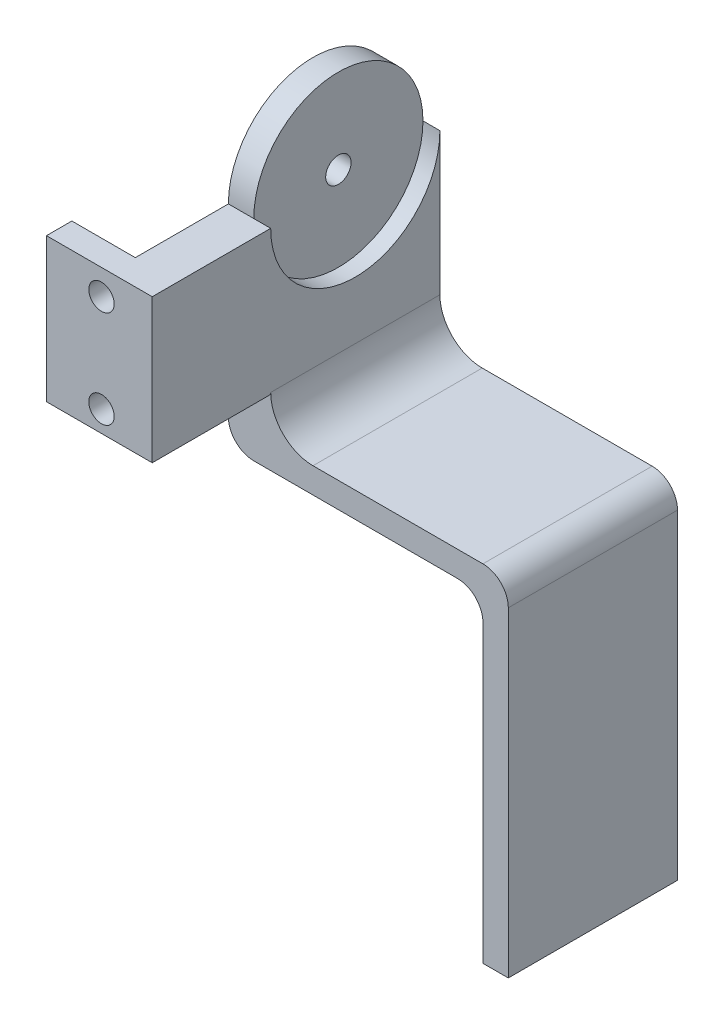
ISO-10303-21;
HEADER;
FILE_DESCRIPTION(('STEP AP214'),'2;1');
FILE_NAME('part.step','',(''),(''),'','','');
FILE_SCHEMA(('AUTOMOTIVE_DESIGN { 1 0 10303 214 1 1 1 1 }'));
ENDSEC;
DATA;
#1=APPLICATION_CONTEXT('core data for automotive mechanical design processes');
#2=APPLICATION_PROTOCOL_DEFINITION('international standard','automotive_design',2000,#1);
#3=PRODUCT_CONTEXT('',#1,'mechanical');
#4=PRODUCT('Part','Part','',(#3));
#5=PRODUCT_RELATED_PRODUCT_CATEGORY('part','',(#4));
#6=PRODUCT_DEFINITION_FORMATION('','',#4);
#7=PRODUCT_DEFINITION_CONTEXT('part definition',#1,'design');
#8=PRODUCT_DEFINITION('design','',#6,#7);
#9=PRODUCT_DEFINITION_SHAPE('','',#8);
#10=(LENGTH_UNIT() NAMED_UNIT(*) SI_UNIT(.MILLI.,.METRE.));
#11=(NAMED_UNIT(*) PLANE_ANGLE_UNIT() SI_UNIT($,.RADIAN.));
#12=(NAMED_UNIT(*) SI_UNIT($,.STERADIAN.) SOLID_ANGLE_UNIT());
#13=UNCERTAINTY_MEASURE_WITH_UNIT(LENGTH_MEASURE(1.E-05),#10,'distance_accuracy_value','');
#14=(GEOMETRIC_REPRESENTATION_CONTEXT(3) GLOBAL_UNCERTAINTY_ASSIGNED_CONTEXT((#13)) GLOBAL_UNIT_ASSIGNED_CONTEXT((#10,
#11,#12)) REPRESENTATION_CONTEXT('',''));
#15=CARTESIAN_POINT('',(0.,0.,0.));
#16=DIRECTION('',(0.,0.,1.));
#17=DIRECTION('',(1.,0.,0.));
#18=AXIS2_PLACEMENT_3D('',#15,#16,#17);
#19=CARTESIAN_POINT('',(-30.0845383421613,31.8,20.));
#20=DIRECTION('',(-1.,0.,0.));
#21=DIRECTION('',(0.,-1.,0.));
#22=AXIS2_PLACEMENT_3D('',#19,#20,#21);
#23=PLANE('',#22);
#24=CARTESIAN_POINT('',(-30.0845383421613,21.8000000000001,10.));
#25=DIRECTION('',(-1.,0.,0.));
#26=DIRECTION('',(0.,-1.,0.));
#27=AXIS2_PLACEMENT_3D('',#24,#25,#26);
#28=CIRCLE('',#27,1.5);
#29=CARTESIAN_POINT('',(-30.0845383421613,20.3000000000001,10.));
#30=VERTEX_POINT('',#29);
#31=EDGE_CURVE('E307',#30,#30,#28,.T.);
#32=ORIENTED_EDGE('',*,*,#31,.T.);
#33=EDGE_LOOP('',(#32));
#34=FACE_BOUND('',#33,.T.);
#35=CARTESIAN_POINT('',(-30.0845383421613,21.8,10.));
#36=DIRECTION('',(-1.,0.,0.));
#37=DIRECTION('',(0.,1.,0.));
#38=AXIS2_PLACEMENT_3D('',#35,#36,#37);
#39=CIRCLE('',#38,10.);
#40=CARTESIAN_POINT('',(-30.0845383421613,21.8,0.));
#41=VERTEX_POINT('',#40);
#42=CARTESIAN_POINT('',(-30.0845383421613,21.8,20.));
#43=VERTEX_POINT('',#42);
#44=EDGE_CURVE('E244',#41,#43,#39,.T.);
#45=ORIENTED_EDGE('',*,*,#44,.F.);
#46=CARTESIAN_POINT('',(-30.0845383421613,21.8,10.));
#47=DIRECTION('',(1.,0.,0.));
#48=DIRECTION('',(0.,1.,0.));
#49=AXIS2_PLACEMENT_3D('',#46,#47,#48);
#50=CIRCLE('',#49,10.);
#51=EDGE_CURVE('E348',#41,#43,#50,.T.);
#52=ORIENTED_EDGE('',*,*,#51,.T.);
#53=EDGE_LOOP('',(#45,#52));
#54=FACE_BOUND('',#53,.T.);
#55=ADVANCED_FACE('F52',(#34,#54),#23,.F.);
#56=CARTESIAN_POINT('',(-40.5845383421613,21.8,31.));
#57=DIRECTION('',(0.,0.,1.));
#58=DIRECTION('',(0.,-1.,0.));
#59=AXIS2_PLACEMENT_3D('',#56,#57,#58);
#60=PLANE('',#59);
#61=CARTESIAN_POINT('',(-34.0845383421613,18.8000000000001,31.));
#62=DIRECTION('',(0.,0.,1.));
#63=DIRECTION('',(0.,-1.,0.));
#64=AXIS2_PLACEMENT_3D('',#61,#62,#63);
#65=CIRCLE('',#64,1.5);
#66=CARTESIAN_POINT('',(-34.0845383421613,17.3000000000001,31.));
#67=VERTEX_POINT('',#66);
#68=EDGE_CURVE('E419',#67,#67,#65,.T.);
#69=ORIENTED_EDGE('',*,*,#68,.T.);
#70=EDGE_LOOP('',(#69));
#71=FACE_BOUND('',#70,.T.);
#72=DIRECTION('',(1.,0.,0.));
#73=VECTOR('',#72,1.);
#74=CARTESIAN_POINT('',(-33.0845383421613,15.3000000000001,31.));
#75=LINE('',#74,#73);
#76=CARTESIAN_POINT('',(-40.5845383421613,15.3000000000001,31.));
#77=VERTEX_POINT('',#76);
#78=CARTESIAN_POINT('',(-33.0845383421613,15.3000000000001,31.));
#79=VERTEX_POINT('',#78);
#80=EDGE_CURVE('E263',#77,#79,#75,.T.);
#81=ORIENTED_EDGE('',*,*,#80,.F.);
#82=DIRECTION('',(0.,-1.,0.));
#83=VECTOR('',#82,1.);
#84=CARTESIAN_POINT('',(-40.5845383421613,21.8,31.));
#85=LINE('',#84,#83);
#86=CARTESIAN_POINT('',(-40.5845383421613,21.8,31.));
#87=VERTEX_POINT('',#86);
#88=EDGE_CURVE('E325',#87,#77,#85,.T.);
#89=ORIENTED_EDGE('',*,*,#88,.F.);
#90=DIRECTION('',(1.,0.,0.));
#91=VECTOR('',#90,1.);
#92=CARTESIAN_POINT('',(-40.5845383421613,21.8,31.));
#93=LINE('',#92,#91);
#94=CARTESIAN_POINT('',(-33.0845383421613,21.8,31.));
#95=VERTEX_POINT('',#94);
#96=EDGE_CURVE('E333',#87,#95,#93,.T.);
#97=ORIENTED_EDGE('',*,*,#96,.T.);
#98=DIRECTION('',(0.,-1.,0.));
#99=VECTOR('',#98,1.);
#100=CARTESIAN_POINT('',(-33.0845383421613,21.8,31.));
#101=LINE('',#100,#99);
#102=CARTESIAN_POINT('',(-33.0845383421613,21.6284271247463,31.));
#103=VERTEX_POINT('',#102);
#104=EDGE_CURVE('E319',#95,#103,#101,.T.);
#105=ORIENTED_EDGE('',*,*,#104,.T.);
#106=CARTESIAN_POINT('',(-34.0845383421613,18.8000000000001,31.));
#107=DIRECTION('',(0.,0.,-1.));
#108=DIRECTION('',(0.,1.,0.));
#109=AXIS2_PLACEMENT_3D('',#106,#107,#108);
#110=CIRCLE('',#109,3.);
#111=CARTESIAN_POINT('',(-33.0845383421613,15.9715728752539,31.));
#112=VERTEX_POINT('',#111);
#113=EDGE_CURVE('E279',#103,#112,#110,.T.);
#114=ORIENTED_EDGE('',*,*,#113,.T.);
#115=EDGE_CURVE('E331',#112,#79,#101,.T.);
#116=ORIENTED_EDGE('',*,*,#115,.T.);
#117=EDGE_LOOP('',(#81,#89,#97,#105,#114,#116));
#118=FACE_BOUND('',#117,.T.);
#119=ADVANCED_FACE('F442',(#71,#118),#60,.F.);
#120=CARTESIAN_POINT('',(-33.0845383421613,31.8,20.));
#121=DIRECTION('',(1.,0.,0.));
#122=DIRECTION('',(0.,1.,0.));
#123=AXIS2_PLACEMENT_3D('',#120,#121,#122);
#124=PLANE('',#123);
#125=CARTESIAN_POINT('',(-33.0845383421613,21.8000000000001,10.));
#126=DIRECTION('',(-1.,0.,0.));
#127=DIRECTION('',(0.,-1.,0.));
#128=AXIS2_PLACEMENT_3D('',#125,#126,#127);
#129=CIRCLE('',#128,1.5);
#130=CARTESIAN_POINT('',(-33.0845383421613,20.3000000000001,10.));
#131=VERTEX_POINT('',#130);
#132=EDGE_CURVE('E304',#131,#131,#129,.T.);
#133=ORIENTED_EDGE('',*,*,#132,.F.);
#134=EDGE_LOOP('',(#133));
#135=FACE_BOUND('',#134,.T.);
#136=CARTESIAN_POINT('',(-33.0845383421613,11.3000000000001,31.));
#137=VERTEX_POINT('',#136);
#138=CARTESIAN_POINT('',(-33.0845383421613,10.1284271247463,31.));
#139=VERTEX_POINT('',#138);
#140=EDGE_CURVE('E314',#137,#139,#101,.T.);
#141=ORIENTED_EDGE('',*,*,#140,.F.);
#142=DIRECTION('',(0.,0.,-1.));
#143=VECTOR('',#142,1.);
#144=CARTESIAN_POINT('',(-33.0845383421613,11.3000000000001,25.5));
#145=LINE('',#144,#143);
#146=CARTESIAN_POINT('',(-33.0845383421613,11.3000000000001,25.5));
#147=VERTEX_POINT('',#146);
#148=EDGE_CURVE('E272',#137,#147,#145,.T.);
#149=ORIENTED_EDGE('',*,*,#148,.T.);
#150=DIRECTION('',(0.,1.,0.));
#151=VECTOR('',#150,1.);
#152=CARTESIAN_POINT('',(-33.0845383421613,11.3000000000001,25.5));
#153=LINE('',#152,#151);
#154=CARTESIAN_POINT('',(-33.0845383421613,15.3000000000001,25.5));
#155=VERTEX_POINT('',#154);
#156=EDGE_CURVE('E276',#147,#155,#153,.T.);
#157=ORIENTED_EDGE('',*,*,#156,.T.);
#158=DIRECTION('',(0.,0.,-1.));
#159=VECTOR('',#158,1.);
#160=CARTESIAN_POINT('',(-33.0845383421613,15.3000000000001,25.5));
#161=LINE('',#160,#159);
#162=EDGE_CURVE('E265',#79,#155,#161,.T.);
#163=ORIENTED_EDGE('',*,*,#162,.F.);
#164=ORIENTED_EDGE('',*,*,#115,.F.);
#165=DIRECTION('',(0.,0.,1.));
#166=VECTOR('',#165,1.);
#167=CARTESIAN_POINT('',(-33.0845383421613,15.9715728752539,23.));
#168=LINE('',#167,#166);
#169=CARTESIAN_POINT('',(-33.0845383421613,15.9715728752539,23.));
#170=VERTEX_POINT('',#169);
#171=EDGE_CURVE('E284',#170,#112,#168,.T.);
#172=ORIENTED_EDGE('',*,*,#171,.F.);
#173=DIRECTION('',(0.,1.,0.));
#174=VECTOR('',#173,1.);
#175=CARTESIAN_POINT('',(-33.0845383421613,31.8,23.));
#176=LINE('',#175,#174);
#177=CARTESIAN_POINT('',(-33.0845383421613,21.6284271247463,23.));
#178=VERTEX_POINT('',#177);
#179=EDGE_CURVE('E60',#170,#178,#176,.T.);
#180=ORIENTED_EDGE('',*,*,#179,.T.);
#181=DIRECTION('',(0.,0.,1.));
#182=VECTOR('',#181,1.);
#183=CARTESIAN_POINT('',(-33.0845383421613,21.6284271247463,23.));
#184=LINE('',#183,#182);
#185=EDGE_CURVE('E294',#103,#178,#184,.F.);
#186=ORIENTED_EDGE('',*,*,#185,.F.);
#187=ORIENTED_EDGE('',*,*,#104,.F.);
#188=DIRECTION('',(0.,0.,-1.));
#189=VECTOR('',#188,1.);
#190=CARTESIAN_POINT('',(-33.0845383421613,21.8,34.));
#191=LINE('',#190,#189);
#192=CARTESIAN_POINT('',(-33.0845383421613,21.8,20.));
#193=VERTEX_POINT('',#192);
#194=EDGE_CURVE('E340',#95,#193,#191,.T.);
#195=ORIENTED_EDGE('',*,*,#194,.T.);
#196=CARTESIAN_POINT('',(-33.0845383421613,21.8,10.));
#197=DIRECTION('',(1.,0.,0.));
#198=DIRECTION('',(0.,1.,0.));
#199=AXIS2_PLACEMENT_3D('',#196,#197,#198);
#200=CIRCLE('',#199,10.);
#201=CARTESIAN_POINT('',(-33.0845383421613,21.8,0.));
#202=VERTEX_POINT('',#201);
#203=EDGE_CURVE('E349',#202,#193,#200,.T.);
#204=ORIENTED_EDGE('',*,*,#203,.F.);
#205=DIRECTION('',(0.,-1.,0.));
#206=VECTOR('',#205,1.);
#207=CARTESIAN_POINT('',(-33.0845383421613,31.8,0.));
#208=LINE('',#207,#206);
#209=CARTESIAN_POINT('',(-33.0845383421613,0.,0.));
#210=VERTEX_POINT('',#209);
#211=EDGE_CURVE('E385',#202,#210,#208,.T.);
#212=ORIENTED_EDGE('',*,*,#211,.T.);
#213=DIRECTION('',(0.,0.,-1.));
#214=VECTOR('',#213,1.);
#215=CARTESIAN_POINT('',(-33.0845383421613,0.,20.));
#216=LINE('',#215,#214);
#217=CARTESIAN_POINT('',(-33.0845383421613,0.,20.));
#218=VERTEX_POINT('',#217);
#219=EDGE_CURVE('E405',#218,#210,#216,.T.);
#220=ORIENTED_EDGE('',*,*,#219,.F.);
#221=DIRECTION('',(0.,-1.,0.));
#222=VECTOR('',#221,1.);
#223=CARTESIAN_POINT('',(-33.0845383421613,31.8,20.));
#224=LINE('',#223,#222);
#225=CARTESIAN_POINT('',(-33.0845383421613,4.80000000000012,20.));
#226=VERTEX_POINT('',#225);
#227=EDGE_CURVE('E367',#226,#218,#224,.T.);
#228=ORIENTED_EDGE('',*,*,#227,.F.);
#229=DIRECTION('',(0.,0.,-1.));
#230=VECTOR('',#229,1.);
#231=CARTESIAN_POINT('',(-33.0845383421613,4.80000000000012,34.));
#232=LINE('',#231,#230);
#233=CARTESIAN_POINT('',(-33.0845383421613,4.80000000000012,23.));
#234=VERTEX_POINT('',#233);
#235=EDGE_CURVE('E343',#234,#226,#232,.T.);
#236=ORIENTED_EDGE('',*,*,#235,.F.);
#237=DIRECTION('',(0.,1.,0.));
#238=VECTOR('',#237,1.);
#239=CARTESIAN_POINT('',(-33.0845383421613,31.8,23.));
#240=LINE('',#239,#238);
#241=CARTESIAN_POINT('',(-33.0845383421613,10.1284271247463,23.));
#242=VERTEX_POINT('',#241);
#243=EDGE_CURVE('E301',#234,#242,#240,.T.);
#244=ORIENTED_EDGE('',*,*,#243,.T.);
#245=DIRECTION('',(0.,0.,1.));
#246=VECTOR('',#245,1.);
#247=CARTESIAN_POINT('',(-33.0845383421613,10.1284271247463,23.));
#248=LINE('',#247,#246);
#249=EDGE_CURVE('E299',#139,#242,#248,.F.);
#250=ORIENTED_EDGE('',*,*,#249,.F.);
#251=EDGE_LOOP('',(#141,#149,#157,#163,#164,#172,#180,#186,#187,#195,#204,#212,#220,#228,#236,
#244,#250));
#252=FACE_BOUND('',#251,.T.);
#253=ADVANCED_FACE('F431',(#135,#252),#124,.F.);
#254=CARTESIAN_POINT('',(-3.,-3.,20.));
#255=DIRECTION('',(0.,0.,1.));
#256=DIRECTION('',(1.,0.,0.));
#257=AXIS2_PLACEMENT_3D('',#254,#255,#256);
#258=PLANE('',#257);
#259=DIRECTION('',(-1.,0.,0.));
#260=VECTOR('',#259,1.);
#261=CARTESIAN_POINT('',(-3.00000000000002,0.,20.));
#262=LINE('',#261,#260);
#263=CARTESIAN_POINT('',(-3.00000000000002,0.,20.));
#264=VERTEX_POINT('',#263);
#265=CARTESIAN_POINT('',(-23.0845383421613,0.,20.));
#266=VERTEX_POINT('',#265);
#267=EDGE_CURVE('E365',#264,#266,#262,.T.);
#268=ORIENTED_EDGE('',*,*,#267,.T.);
#269=CARTESIAN_POINT('',(-23.0845383421613,5.,20.));
#270=DIRECTION('',(0.,0.,1.));
#271=DIRECTION('',(-1.,0.,0.));
#272=AXIS2_PLACEMENT_3D('',#269,#270,#271);
#273=CIRCLE('',#272,5.);
#274=CARTESIAN_POINT('',(-28.0845383421613,5.,20.));
#275=VERTEX_POINT('',#274);
#276=EDGE_CURVE('E238',#275,#266,#273,.T.);
#277=ORIENTED_EDGE('',*,*,#276,.F.);
#278=DIRECTION('',(0.,1.,0.));
#279=VECTOR('',#278,1.);
#280=CARTESIAN_POINT('',(-28.0845383421613,0.,20.));
#281=LINE('',#280,#279);
#282=CARTESIAN_POINT('',(-28.0845383421613,4.80000000000012,20.));
#283=VERTEX_POINT('',#282);
#284=EDGE_CURVE('E12',#283,#275,#281,.T.);
#285=ORIENTED_EDGE('',*,*,#284,.F.);
#286=DIRECTION('',(1.,0.,0.));
#287=VECTOR('',#286,1.);
#288=CARTESIAN_POINT('',(-33.0845383421613,4.80000000000012,20.));
#289=LINE('',#288,#287);
#290=EDGE_CURVE('E335',#226,#283,#289,.T.);
#291=ORIENTED_EDGE('',*,*,#290,.F.);
#292=ORIENTED_EDGE('',*,*,#227,.T.);
#293=CARTESIAN_POINT('',(-30.0845383421613,0.,20.));
#294=DIRECTION('',(0.,0.,1.));
#295=DIRECTION('',(-1.,0.,0.));
#296=AXIS2_PLACEMENT_3D('',#293,#294,#295);
#297=CIRCLE('',#296,3.);
#298=CARTESIAN_POINT('',(-30.0845383421613,-3.,20.));
#299=VERTEX_POINT('',#298);
#300=EDGE_CURVE('E369',#218,#299,#297,.T.);
#301=ORIENTED_EDGE('',*,*,#300,.T.);
#302=DIRECTION('',(1.,0.,0.));
#303=VECTOR('',#302,1.);
#304=CARTESIAN_POINT('',(-30.0845383421613,-3.,20.));
#305=LINE('',#304,#303);
#306=CARTESIAN_POINT('',(-6.00000000000002,-3.,20.));
#307=VERTEX_POINT('',#306);
#308=EDGE_CURVE('E371',#299,#307,#305,.T.);
#309=ORIENTED_EDGE('',*,*,#308,.T.);
#310=CARTESIAN_POINT('',(-6.,-6.,20.));
#311=DIRECTION('',(0.,0.,-1.));
#312=DIRECTION('',(1.,0.,0.));
#313=AXIS2_PLACEMENT_3D('',#310,#311,#312);
#314=CIRCLE('',#313,3.);
#315=CARTESIAN_POINT('',(-3.,-6.00000000000003,20.));
#316=VERTEX_POINT('',#315);
#317=EDGE_CURVE('E373',#307,#316,#314,.T.);
#318=ORIENTED_EDGE('',*,*,#317,.T.);
#319=DIRECTION('',(0.,-1.,0.));
#320=VECTOR('',#319,1.);
#321=CARTESIAN_POINT('',(-3.,-6.00000000000003,20.));
#322=LINE('',#321,#320);
#323=CARTESIAN_POINT('',(-3.,-40.891511,20.));
#324=VERTEX_POINT('',#323);
#325=EDGE_CURVE('E375',#316,#324,#322,.T.);
#326=ORIENTED_EDGE('',*,*,#325,.T.);
#327=DIRECTION('',(1.,0.,0.));
#328=VECTOR('',#327,1.);
#329=CARTESIAN_POINT('',(-3.,-40.891511,20.));
#330=LINE('',#329,#328);
#331=CARTESIAN_POINT('',(0.,-40.891511,20.));
#332=VERTEX_POINT('',#331);
#333=EDGE_CURVE('E357',#324,#332,#330,.T.);
#334=ORIENTED_EDGE('',*,*,#333,.T.);
#335=DIRECTION('',(0.,1.,0.));
#336=VECTOR('',#335,1.);
#337=CARTESIAN_POINT('',(0.,-3.00000000000002,20.));
#338=LINE('',#337,#336);
#339=CARTESIAN_POINT('',(0.,-3.00000000000002,20.));
#340=VERTEX_POINT('',#339);
#341=EDGE_CURVE('E360',#332,#340,#338,.T.);
#342=ORIENTED_EDGE('',*,*,#341,.T.);
#343=CARTESIAN_POINT('',(-3.,-3.,20.));
#344=DIRECTION('',(0.,0.,1.));
#345=DIRECTION('',(1.,0.,0.));
#346=AXIS2_PLACEMENT_3D('',#343,#344,#345);
#347=CIRCLE('',#346,3.);
#348=EDGE_CURVE('E363',#340,#264,#347,.T.);
#349=ORIENTED_EDGE('',*,*,#348,.T.);
#350=EDGE_LOOP('',(#268,#277,#285,#291,#292,#301,#309,#318,#326,#334,#342,#349));
#351=FACE_BOUND('',#350,.T.);
#352=ADVANCED_FACE('F500',(#351),#258,.T.);
#353=CARTESIAN_POINT('',(-3.,-40.891511,20.));
#354=DIRECTION('',(0.,1.,0.));
#355=DIRECTION('',(0.,0.,1.));
#356=AXIS2_PLACEMENT_3D('',#353,#354,#355);
#357=PLANE('',#356);
#358=DIRECTION('',(1.,0.,0.));
#359=VECTOR('',#358,1.);
#360=CARTESIAN_POINT('',(-3.,-40.891511,0.));
#361=LINE('',#360,#359);
#362=CARTESIAN_POINT('',(-3.,-40.891511,0.));
#363=VERTEX_POINT('',#362);
#364=CARTESIAN_POINT('',(0.,-40.891511,0.));
#365=VERTEX_POINT('',#364);
#366=EDGE_CURVE('E356',#363,#365,#361,.T.);
#367=ORIENTED_EDGE('',*,*,#366,.T.);
#368=DIRECTION('',(0.,0.,-1.));
#369=VECTOR('',#368,1.);
#370=CARTESIAN_POINT('',(0.,-40.891511,20.));
#371=LINE('',#370,#369);
#372=EDGE_CURVE('E413',#332,#365,#371,.T.);
#373=ORIENTED_EDGE('',*,*,#372,.F.);
#374=ORIENTED_EDGE('',*,*,#333,.F.);
#375=DIRECTION('',(0.,0.,-1.));
#376=VECTOR('',#375,1.);
#377=CARTESIAN_POINT('',(-3.,-40.891511,20.));
#378=LINE('',#377,#376);
#379=EDGE_CURVE('E377',#324,#363,#378,.T.);
#380=ORIENTED_EDGE('',*,*,#379,.T.);
#381=EDGE_LOOP('',(#367,#373,#374,#380));
#382=FACE_BOUND('',#381,.T.);
#383=ADVANCED_FACE('F54',(#382),#357,.F.);
#384=CARTESIAN_POINT('',(0.,-3.00000000000002,20.));
#385=DIRECTION('',(-1.,0.,0.));
#386=DIRECTION('',(0.,-1.,0.));
#387=AXIS2_PLACEMENT_3D('',#384,#385,#386);
#388=PLANE('',#387);
#389=DIRECTION('',(0.,1.,0.));
#390=VECTOR('',#389,1.);
#391=CARTESIAN_POINT('',(0.,-3.00000000000002,0.));
#392=LINE('',#391,#390);
#393=CARTESIAN_POINT('',(0.,-3.00000000000002,0.));
#394=VERTEX_POINT('',#393);
#395=EDGE_CURVE('E380',#365,#394,#392,.T.);
#396=ORIENTED_EDGE('',*,*,#395,.T.);
#397=DIRECTION('',(0.,0.,-1.));
#398=VECTOR('',#397,1.);
#399=CARTESIAN_POINT('',(0.,-3.00000000000002,20.));
#400=LINE('',#399,#398);
#401=EDGE_CURVE('E410',#340,#394,#400,.T.);
#402=ORIENTED_EDGE('',*,*,#401,.F.);
#403=ORIENTED_EDGE('',*,*,#341,.F.);
#404=ORIENTED_EDGE('',*,*,#372,.T.);
#405=EDGE_LOOP('',(#396,#402,#403,#404));
#406=FACE_BOUND('',#405,.T.);
#407=ADVANCED_FACE('F534',(#406),#388,.F.);
#408=CARTESIAN_POINT('',(-3.,-3.,20.));
#409=DIRECTION('',(0.,0.,-1.));
#410=DIRECTION('',(-1.,0.,0.));
#411=AXIS2_PLACEMENT_3D('',#408,#409,#410);
#412=CYLINDRICAL_SURFACE('',#411,3.);
#413=CARTESIAN_POINT('',(-3.,-3.,0.));
#414=DIRECTION('',(0.,0.,1.));
#415=DIRECTION('',(1.,0.,0.));
#416=AXIS2_PLACEMENT_3D('',#413,#414,#415);
#417=CIRCLE('',#416,3.);
#418=CARTESIAN_POINT('',(-3.00000000000002,0.,0.));
#419=VERTEX_POINT('',#418);
#420=EDGE_CURVE('E382',#394,#419,#417,.T.);
#421=ORIENTED_EDGE('',*,*,#420,.T.);
#422=DIRECTION('',(0.,0.,-1.));
#423=VECTOR('',#422,1.);
#424=CARTESIAN_POINT('',(-3.00000000000002,0.,20.));
#425=LINE('',#424,#423);
#426=EDGE_CURVE('E408',#264,#419,#425,.T.);
#427=ORIENTED_EDGE('',*,*,#426,.F.);
#428=ORIENTED_EDGE('',*,*,#348,.F.);
#429=ORIENTED_EDGE('',*,*,#401,.T.);
#430=EDGE_LOOP('',(#421,#427,#428,#429));
#431=FACE_BOUND('',#430,.T.);
#432=ADVANCED_FACE('F532',(#431),#412,.T.);
#433=CARTESIAN_POINT('',(-3.00000000000002,0.,20.));
#434=DIRECTION('',(0.,-1.,0.));
#435=DIRECTION('',(1.,0.,0.));
#436=AXIS2_PLACEMENT_3D('',#433,#434,#435);
#437=PLANE('',#436);
#438=DIRECTION('',(-1.,0.,0.));
#439=VECTOR('',#438,1.);
#440=CARTESIAN_POINT('',(-3.00000000000002,0.,0.));
#441=LINE('',#440,#439);
#442=CARTESIAN_POINT('',(-23.0845383421613,0.,0.));
#443=VERTEX_POINT('',#442);
#444=EDGE_CURVE('E72',#419,#443,#441,.T.);
#445=ORIENTED_EDGE('',*,*,#444,.T.);
#446=DIRECTION('',(0.,0.,-1.));
#447=VECTOR('',#446,1.);
#448=CARTESIAN_POINT('',(-23.0845383421613,0.,20.));
#449=LINE('',#448,#447);
#450=EDGE_CURVE('E67',#266,#443,#449,.T.);
#451=ORIENTED_EDGE('',*,*,#450,.F.);
#452=ORIENTED_EDGE('',*,*,#267,.F.);
#453=ORIENTED_EDGE('',*,*,#426,.T.);
#454=EDGE_LOOP('',(#445,#451,#452,#453));
#455=FACE_BOUND('',#454,.T.);
#456=ADVANCED_FACE('F529',(#455),#437,.F.);
#457=CARTESIAN_POINT('',(-30.0845383421613,0.,20.));
#458=DIRECTION('',(0.,0.,-1.));
#459=DIRECTION('',(-1.,0.,0.));
#460=AXIS2_PLACEMENT_3D('',#457,#458,#459);
#461=CYLINDRICAL_SURFACE('',#460,3.);
#462=CARTESIAN_POINT('',(-30.0845383421613,0.,0.));
#463=DIRECTION('',(0.,0.,1.));
#464=DIRECTION('',(-1.,0.,0.));
#465=AXIS2_PLACEMENT_3D('',#462,#463,#464);
#466=CIRCLE('',#465,3.);
#467=CARTESIAN_POINT('',(-30.0845383421613,-3.,0.));
#468=VERTEX_POINT('',#467);
#469=EDGE_CURVE('E387',#210,#468,#466,.T.);
#470=ORIENTED_EDGE('',*,*,#469,.T.);
#471=DIRECTION('',(0.,0.,-1.));
#472=VECTOR('',#471,1.);
#473=CARTESIAN_POINT('',(-30.0845383421613,-3.,20.));
#474=LINE('',#473,#472);
#475=EDGE_CURVE('E402',#299,#468,#474,.T.);
#476=ORIENTED_EDGE('',*,*,#475,.F.);
#477=ORIENTED_EDGE('',*,*,#300,.F.);
#478=ORIENTED_EDGE('',*,*,#219,.T.);
#479=EDGE_LOOP('',(#470,#476,#477,#478));
#480=FACE_BOUND('',#479,.T.);
#481=ADVANCED_FACE('F492',(#480),#461,.T.);
#482=CARTESIAN_POINT('',(-30.0845383421613,-3.,20.));
#483=DIRECTION('',(0.,1.,0.));
#484=DIRECTION('',(0.,0.,1.));
#485=AXIS2_PLACEMENT_3D('',#482,#483,#484);
#486=PLANE('',#485);
#487=DIRECTION('',(1.,0.,0.));
#488=VECTOR('',#487,1.);
#489=CARTESIAN_POINT('',(-30.0845383421613,-3.,0.));
#490=LINE('',#489,#488);
#491=CARTESIAN_POINT('',(-6.00000000000002,-3.,0.));
#492=VERTEX_POINT('',#491);
#493=EDGE_CURVE('E389',#468,#492,#490,.T.);
#494=ORIENTED_EDGE('',*,*,#493,.T.);
#495=DIRECTION('',(0.,0.,-1.));
#496=VECTOR('',#495,1.);
#497=CARTESIAN_POINT('',(-6.00000000000002,-3.,20.));
#498=LINE('',#497,#496);
#499=EDGE_CURVE('E399',#307,#492,#498,.T.);
#500=ORIENTED_EDGE('',*,*,#499,.F.);
#501=ORIENTED_EDGE('',*,*,#308,.F.);
#502=ORIENTED_EDGE('',*,*,#475,.T.);
#503=EDGE_LOOP('',(#494,#500,#501,#502));
#504=FACE_BOUND('',#503,.T.);
#505=ADVANCED_FACE('F496',(#504),#486,.F.);
#506=CARTESIAN_POINT('',(-6.,-6.,20.));
#507=DIRECTION('',(0.,0.,-1.));
#508=DIRECTION('',(-1.,0.,0.));
#509=AXIS2_PLACEMENT_3D('',#506,#507,#508);
#510=CYLINDRICAL_SURFACE('',#509,3.);
#511=CARTESIAN_POINT('',(-6.,-6.,0.));
#512=DIRECTION('',(0.,0.,-1.));
#513=DIRECTION('',(1.,0.,0.));
#514=AXIS2_PLACEMENT_3D('',#511,#512,#513);
#515=CIRCLE('',#514,3.);
#516=CARTESIAN_POINT('',(-3.,-6.00000000000003,0.));
#517=VERTEX_POINT('',#516);
#518=EDGE_CURVE('E391',#492,#517,#515,.T.);
#519=ORIENTED_EDGE('',*,*,#518,.T.);
#520=DIRECTION('',(0.,0.,-1.));
#521=VECTOR('',#520,1.);
#522=CARTESIAN_POINT('',(-3.,-6.00000000000003,20.));
#523=LINE('',#522,#521);
#524=EDGE_CURVE('E396',#316,#517,#523,.T.);
#525=ORIENTED_EDGE('',*,*,#524,.F.);
#526=ORIENTED_EDGE('',*,*,#317,.F.);
#527=ORIENTED_EDGE('',*,*,#499,.T.);
#528=EDGE_LOOP('',(#519,#525,#526,#527));
#529=FACE_BOUND('',#528,.T.);
#530=ADVANCED_FACE('F555',(#529),#510,.F.);
#531=CARTESIAN_POINT('',(-3.,-6.00000000000003,20.));
#532=DIRECTION('',(1.,0.,0.));
#533=DIRECTION('',(0.,1.,0.));
#534=AXIS2_PLACEMENT_3D('',#531,#532,#533);
#535=PLANE('',#534);
#536=DIRECTION('',(0.,-1.,0.));
#537=VECTOR('',#536,1.);
#538=CARTESIAN_POINT('',(-3.,-6.00000000000003,0.));
#539=LINE('',#538,#537);
#540=EDGE_CURVE('E361',#517,#363,#539,.T.);
#541=ORIENTED_EDGE('',*,*,#540,.T.);
#542=ORIENTED_EDGE('',*,*,#379,.F.);
#543=ORIENTED_EDGE('',*,*,#325,.F.);
#544=ORIENTED_EDGE('',*,*,#524,.T.);
#545=EDGE_LOOP('',(#541,#542,#543,#544));
#546=FACE_BOUND('',#545,.T.);
#547=ADVANCED_FACE('F553',(#546),#535,.F.);
#548=CARTESIAN_POINT('',(-3.,-3.,0.));
#549=DIRECTION('',(0.,0.,1.));
#550=DIRECTION('',(1.,0.,0.));
#551=AXIS2_PLACEMENT_3D('',#548,#549,#550);
#552=PLANE('',#551);
#553=DIRECTION('',(0.,1.,0.));
#554=VECTOR('',#553,1.);
#555=CARTESIAN_POINT('',(-28.0845383421613,21.8,0.));
#556=LINE('',#555,#554);
#557=CARTESIAN_POINT('',(-28.0845383421613,5.,0.));
#558=VERTEX_POINT('',#557);
#559=CARTESIAN_POINT('',(-28.0845383421613,21.8,0.));
#560=VERTEX_POINT('',#559);
#561=EDGE_CURVE('E218',#558,#560,#556,.T.);
#562=ORIENTED_EDGE('',*,*,#561,.F.);
#563=CARTESIAN_POINT('',(-23.0845383421613,5.,0.));
#564=DIRECTION('',(0.,0.,1.));
#565=DIRECTION('',(-1.,0.,0.));
#566=AXIS2_PLACEMENT_3D('',#563,#564,#565);
#567=CIRCLE('',#566,5.);
#568=EDGE_CURVE('E222',#558,#443,#567,.T.);
#569=ORIENTED_EDGE('',*,*,#568,.T.);
#570=ORIENTED_EDGE('',*,*,#444,.F.);
#571=ORIENTED_EDGE('',*,*,#420,.F.);
#572=ORIENTED_EDGE('',*,*,#395,.F.);
#573=ORIENTED_EDGE('',*,*,#366,.F.);
#574=ORIENTED_EDGE('',*,*,#540,.F.);
#575=ORIENTED_EDGE('',*,*,#518,.F.);
#576=ORIENTED_EDGE('',*,*,#493,.F.);
#577=ORIENTED_EDGE('',*,*,#469,.F.);
#578=ORIENTED_EDGE('',*,*,#211,.F.);
#579=DIRECTION('',(1.,0.,0.));
#580=VECTOR('',#579,1.);
#581=CARTESIAN_POINT('',(-33.0845383421613,21.8,0.));
#582=LINE('',#581,#580);
#583=EDGE_CURVE('E352',#202,#41,#582,.T.);
#584=ORIENTED_EDGE('',*,*,#583,.T.);
#585=DIRECTION('',(-1.,0.,0.));
#586=VECTOR('',#585,1.);
#587=CARTESIAN_POINT('',(-28.0845383421613,21.8,0.));
#588=LINE('',#587,#586);
#589=EDGE_CURVE('E224',#560,#41,#588,.T.);
#590=ORIENTED_EDGE('',*,*,#589,.F.);
#591=EDGE_LOOP('',(#562,#569,#570,#571,#572,#573,#574,#575,#576,#577,#578,#584,#590));
#592=FACE_BOUND('',#591,.T.);
#593=ADVANCED_FACE('F220',(#592),#552,.F.);
#594=CARTESIAN_POINT('',(-33.0845383421613,21.8,10.));
#595=DIRECTION('',(1.,0.,0.));
#596=DIRECTION('',(0.,1.,0.));
#597=AXIS2_PLACEMENT_3D('',#594,#595,#596);
#598=CYLINDRICAL_SURFACE('',#597,10.);
#599=ORIENTED_EDGE('',*,*,#51,.F.);
#600=ORIENTED_EDGE('',*,*,#583,.F.);
#601=ORIENTED_EDGE('',*,*,#203,.T.);
#602=DIRECTION('',(1.,0.,0.));
#603=VECTOR('',#602,1.);
#604=CARTESIAN_POINT('',(-33.0845383421613,21.8,20.));
#605=LINE('',#604,#603);
#606=EDGE_CURVE('E345',#193,#43,#605,.T.);
#607=ORIENTED_EDGE('',*,*,#606,.T.);
#608=EDGE_LOOP('',(#599,#600,#601,#607));
#609=FACE_BOUND('',#608,.T.);
#610=ADVANCED_FACE('F484',(#609),#598,.T.);
#611=CARTESIAN_POINT('',(-33.0845383421613,4.80000000000012,34.));
#612=DIRECTION('',(0.,1.,0.));
#613=DIRECTION('',(0.,0.,1.));
#614=AXIS2_PLACEMENT_3D('',#611,#612,#613);
#615=PLANE('',#614);
#616=DIRECTION('',(0.,0.,1.));
#617=VECTOR('',#616,1.);
#618=CARTESIAN_POINT('',(-32.4262259469836,4.80000000000012,23.));
#619=LINE('',#618,#617);
#620=CARTESIAN_POINT('',(-32.4262259469836,4.80000000000012,23.));
#621=VERTEX_POINT('',#620);
#622=CARTESIAN_POINT('',(-32.4262259469836,4.80000000000012,31.));
#623=VERTEX_POINT('',#622);
#624=EDGE_CURVE('E296',#621,#623,#619,.T.);
#625=ORIENTED_EDGE('',*,*,#624,.F.);
#626=DIRECTION('',(-1.,0.,0.));
#627=VECTOR('',#626,1.);
#628=CARTESIAN_POINT('',(-33.0845383421613,4.80000000000012,23.));
#629=LINE('',#628,#627);
#630=EDGE_CURVE('E422',#621,#234,#629,.T.);
#631=ORIENTED_EDGE('',*,*,#630,.T.);
#632=ORIENTED_EDGE('',*,*,#235,.T.);
#633=ORIENTED_EDGE('',*,*,#290,.T.);
#634=DIRECTION('',(0.,0.,-1.));
#635=VECTOR('',#634,1.);
#636=CARTESIAN_POINT('',(-28.0845383421613,4.80000000000012,34.));
#637=LINE('',#636,#635);
#638=CARTESIAN_POINT('',(-28.0845383421613,4.80000000000012,34.));
#639=VERTEX_POINT('',#638);
#640=EDGE_CURVE('E255',#639,#283,#637,.T.);
#641=ORIENTED_EDGE('',*,*,#640,.F.);
#642=DIRECTION('',(1.,0.,0.));
#643=VECTOR('',#642,1.);
#644=CARTESIAN_POINT('',(-33.0845383421613,4.80000000000012,34.));
#645=LINE('',#644,#643);
#646=CARTESIAN_POINT('',(-40.5845383421613,4.80000000000012,34.));
#647=VERTEX_POINT('',#646);
#648=EDGE_CURVE('E336',#647,#639,#645,.T.);
#649=ORIENTED_EDGE('',*,*,#648,.F.);
#650=DIRECTION('',(0.,0.,1.));
#651=VECTOR('',#650,1.);
#652=CARTESIAN_POINT('',(-40.5845383421613,4.80000000000011,31.));
#653=LINE('',#652,#651);
#654=CARTESIAN_POINT('',(-40.5845383421613,4.80000000000011,31.));
#655=VERTEX_POINT('',#654);
#656=EDGE_CURVE('E315',#655,#647,#653,.T.);
#657=ORIENTED_EDGE('',*,*,#656,.F.);
#658=DIRECTION('',(1.,0.,0.));
#659=VECTOR('',#658,1.);
#660=CARTESIAN_POINT('',(-40.5845383421613,4.80000000000011,31.));
#661=LINE('',#660,#659);
#662=EDGE_CURVE('E328',#655,#623,#661,.T.);
#663=ORIENTED_EDGE('',*,*,#662,.T.);
#664=EDGE_LOOP('',(#625,#631,#632,#633,#641,#649,#657,#663));
#665=FACE_BOUND('',#664,.T.);
#666=ADVANCED_FACE('F461',(#665),#615,.F.);
#667=CARTESIAN_POINT('',(-33.0845383421613,21.8,34.));
#668=DIRECTION('',(0.,-1.,0.));
#669=DIRECTION('',(0.,0.,-1.));
#670=AXIS2_PLACEMENT_3D('',#667,#668,#669);
#671=PLANE('',#670);
#672=ORIENTED_EDGE('',*,*,#606,.F.);
#673=ORIENTED_EDGE('',*,*,#194,.F.);
#674=ORIENTED_EDGE('',*,*,#96,.F.);
#675=DIRECTION('',(0.,0.,-1.));
#676=VECTOR('',#675,1.);
#677=CARTESIAN_POINT('',(-40.5845383421613,21.8,34.));
#678=LINE('',#677,#676);
#679=CARTESIAN_POINT('',(-40.5845383421613,21.8,34.));
#680=VERTEX_POINT('',#679);
#681=EDGE_CURVE('E322',#680,#87,#678,.T.);
#682=ORIENTED_EDGE('',*,*,#681,.F.);
#683=DIRECTION('',(-1.,0.,0.));
#684=VECTOR('',#683,1.);
#685=CARTESIAN_POINT('',(-33.0845383421613,21.8,34.));
#686=LINE('',#685,#684);
#687=CARTESIAN_POINT('',(-28.0845383421613,21.8,34.));
#688=VERTEX_POINT('',#687);
#689=EDGE_CURVE('E338',#688,#680,#686,.T.);
#690=ORIENTED_EDGE('',*,*,#689,.F.);
#691=DIRECTION('',(0.,0.,1.));
#692=VECTOR('',#691,1.);
#693=CARTESIAN_POINT('',(-28.0845383421613,21.8,20.));
#694=LINE('',#693,#692);
#695=CARTESIAN_POINT('',(-28.0845383421613,21.8,20.));
#696=VERTEX_POINT('',#695);
#697=EDGE_CURVE('E249',#696,#688,#694,.T.);
#698=ORIENTED_EDGE('',*,*,#697,.F.);
#699=DIRECTION('',(-1.,0.,0.));
#700=VECTOR('',#699,1.);
#701=CARTESIAN_POINT('',(-28.0845383421613,21.8,20.));
#702=LINE('',#701,#700);
#703=EDGE_CURVE('E257',#696,#43,#702,.T.);
#704=ORIENTED_EDGE('',*,*,#703,.T.);
#705=EDGE_LOOP('',(#672,#673,#674,#682,#690,#698,#704));
#706=FACE_BOUND('',#705,.T.);
#707=ADVANCED_FACE('F480',(#706),#671,.F.);
#708=CARTESIAN_POINT('',(0.,0.,34.));
#709=DIRECTION('',(0.,0.,1.));
#710=DIRECTION('',(1.,0.,0.));
#711=AXIS2_PLACEMENT_3D('',#708,#709,#710);
#712=PLANE('',#711);
#713=CARTESIAN_POINT('',(-34.0845383421613,18.8000000000001,34.));
#714=DIRECTION('',(0.,0.,1.));
#715=DIRECTION('',(1.,0.,0.));
#716=AXIS2_PLACEMENT_3D('',#713,#714,#715);
#717=CIRCLE('',#716,1.5);
#718=CARTESIAN_POINT('',(-32.5845383421613,18.8000000000001,34.));
#719=VERTEX_POINT('',#718);
#720=EDGE_CURVE('E311',#719,#719,#717,.T.);
#721=ORIENTED_EDGE('',*,*,#720,.F.);
#722=EDGE_LOOP('',(#721));
#723=FACE_BOUND('',#722,.T.);
#724=CARTESIAN_POINT('',(-34.0845383421613,7.30000000000012,34.));
#725=DIRECTION('',(0.,0.,1.));
#726=DIRECTION('',(1.,0.,0.));
#727=AXIS2_PLACEMENT_3D('',#724,#725,#726);
#728=CIRCLE('',#727,1.5);
#729=CARTESIAN_POINT('',(-32.5845383421613,7.30000000000012,34.));
#730=VERTEX_POINT('',#729);
#731=EDGE_CURVE('E308',#730,#730,#728,.T.);
#732=ORIENTED_EDGE('',*,*,#731,.F.);
#733=EDGE_LOOP('',(#732));
#734=FACE_BOUND('',#733,.T.);
#735=ORIENTED_EDGE('',*,*,#689,.T.);
#736=DIRECTION('',(0.,1.,0.));
#737=VECTOR('',#736,1.);
#738=CARTESIAN_POINT('',(-40.5845383421613,4.80000000000012,34.));
#739=LINE('',#738,#737);
#740=EDGE_CURVE('E318',#647,#680,#739,.T.);
#741=ORIENTED_EDGE('',*,*,#740,.F.);
#742=ORIENTED_EDGE('',*,*,#648,.T.);
#743=DIRECTION('',(0.,-1.,0.));
#744=VECTOR('',#743,1.);
#745=CARTESIAN_POINT('',(-28.0845383421613,21.8,34.));
#746=LINE('',#745,#744);
#747=EDGE_CURVE('E252',#688,#639,#746,.T.);
#748=ORIENTED_EDGE('',*,*,#747,.F.);
#749=EDGE_LOOP('',(#735,#741,#742,#748));
#750=FACE_BOUND('',#749,.T.);
#751=ADVANCED_FACE('F505',(#723,#734,#750),#712,.T.);
#752=CARTESIAN_POINT('',(-40.5845383421613,11.3000000000001,31.));
#753=VERTEX_POINT('',#752);
#754=EDGE_CURVE('E324',#753,#655,#85,.T.);
#755=ORIENTED_EDGE('',*,*,#754,.F.);
#756=DIRECTION('',(1.,0.,0.));
#757=VECTOR('',#756,1.);
#758=CARTESIAN_POINT('',(-33.0845383421613,11.3000000000001,31.));
#759=LINE('',#758,#757);
#760=EDGE_CURVE('E269',#753,#137,#759,.T.);
#761=ORIENTED_EDGE('',*,*,#760,.T.);
#762=ORIENTED_EDGE('',*,*,#140,.T.);
#763=CARTESIAN_POINT('',(-34.0845383421613,7.30000000000011,31.));
#764=DIRECTION('',(0.,0.,-1.));
#765=DIRECTION('',(0.,1.,0.));
#766=AXIS2_PLACEMENT_3D('',#763,#764,#765);
#767=CIRCLE('',#766,3.);
#768=EDGE_CURVE('E285',#139,#623,#767,.T.);
#769=ORIENTED_EDGE('',*,*,#768,.T.);
#770=ORIENTED_EDGE('',*,*,#662,.F.);
#771=EDGE_LOOP('',(#755,#761,#762,#769,#770));
#772=FACE_BOUND('',#771,.T.);
#773=CARTESIAN_POINT('',(-34.0845383421613,7.30000000000011,31.));
#774=DIRECTION('',(0.,0.,1.));
#775=DIRECTION('',(0.,-1.,0.));
#776=AXIS2_PLACEMENT_3D('',#773,#774,#775);
#777=CIRCLE('',#776,1.5);
#778=CARTESIAN_POINT('',(-34.0845383421613,5.80000000000011,31.));
#779=VERTEX_POINT('',#778);
#780=EDGE_CURVE('E416',#779,#779,#777,.T.);
#781=ORIENTED_EDGE('',*,*,#780,.T.);
#782=EDGE_LOOP('',(#781));
#783=FACE_BOUND('',#782,.T.);
#784=ADVANCED_FACE('F447',(#772,#783),#60,.F.);
#785=CARTESIAN_POINT('',(-40.5845383421613,0.,0.));
#786=DIRECTION('',(-1.,0.,0.));
#787=DIRECTION('',(0.,-1.,0.));
#788=AXIS2_PLACEMENT_3D('',#785,#786,#787);
#789=PLANE('',#788);
#790=ORIENTED_EDGE('',*,*,#656,.T.);
#791=ORIENTED_EDGE('',*,*,#740,.T.);
#792=ORIENTED_EDGE('',*,*,#681,.T.);
#793=ORIENTED_EDGE('',*,*,#88,.T.);
#794=DIRECTION('',(0.,1.,0.));
#795=VECTOR('',#794,1.);
#796=CARTESIAN_POINT('',(-40.5845383421613,11.3000000000001,31.));
#797=LINE('',#796,#795);
#798=EDGE_CURVE('E275',#753,#77,#797,.T.);
#799=ORIENTED_EDGE('',*,*,#798,.F.);
#800=ORIENTED_EDGE('',*,*,#754,.T.);
#801=EDGE_LOOP('',(#790,#791,#792,#793,#799,#800));
#802=FACE_BOUND('',#801,.T.);
#803=ADVANCED_FACE('F466',(#802),#789,.T.);
#804=CARTESIAN_POINT('',(-34.0845383421613,7.30000000000012,38.5));
#805=DIRECTION('',(0.,0.,-1.));
#806=DIRECTION('',(0.,1.,0.));
#807=AXIS2_PLACEMENT_3D('',#804,#805,#806);
#808=CYLINDRICAL_SURFACE('',#807,1.5);
#809=ORIENTED_EDGE('',*,*,#731,.T.);
#810=EDGE_LOOP('',(#809));
#811=FACE_BOUND('',#810,.T.);
#812=ORIENTED_EDGE('',*,*,#780,.F.);
#813=EDGE_LOOP('',(#812));
#814=FACE_BOUND('',#813,.T.);
#815=ADVANCED_FACE('F607',(#811,#814),#808,.F.);
#816=CARTESIAN_POINT('',(-34.0845383421613,18.8000000000001,38.5));
#817=DIRECTION('',(0.,0.,-1.));
#818=DIRECTION('',(0.,1.,0.));
#819=AXIS2_PLACEMENT_3D('',#816,#817,#818);
#820=CYLINDRICAL_SURFACE('',#819,1.5);
#821=ORIENTED_EDGE('',*,*,#720,.T.);
#822=EDGE_LOOP('',(#821));
#823=FACE_BOUND('',#822,.T.);
#824=ORIENTED_EDGE('',*,*,#68,.F.);
#825=EDGE_LOOP('',(#824));
#826=FACE_BOUND('',#825,.T.);
#827=ADVANCED_FACE('F597',(#823,#826),#820,.F.);
#828=CARTESIAN_POINT('',(-23.0845383421613,21.8000000000001,10.));
#829=DIRECTION('',(-1.,0.,0.));
#830=DIRECTION('',(0.,-1.,0.));
#831=AXIS2_PLACEMENT_3D('',#828,#829,#830);
#832=CYLINDRICAL_SURFACE('',#831,1.5);
#833=ORIENTED_EDGE('',*,*,#132,.T.);
#834=EDGE_LOOP('',(#833));
#835=FACE_BOUND('',#834,.T.);
#836=ORIENTED_EDGE('',*,*,#31,.F.);
#837=EDGE_LOOP('',(#836));
#838=FACE_BOUND('',#837,.T.);
#839=ADVANCED_FACE('F592',(#835,#838),#832,.F.);
#840=CARTESIAN_POINT('',(-34.0845383421613,18.8000000000001,23.));
#841=DIRECTION('',(0.,0.,-1.));
#842=DIRECTION('',(0.,1.,0.));
#843=AXIS2_PLACEMENT_3D('',#840,#841,#842);
#844=PLANE('',#843);
#845=CARTESIAN_POINT('',(-34.0845383421613,18.8000000000001,23.));
#846=DIRECTION('',(0.,0.,-1.));
#847=DIRECTION('',(0.,1.,0.));
#848=AXIS2_PLACEMENT_3D('',#845,#846,#847);
#849=CIRCLE('',#848,3.);
#850=EDGE_CURVE('E288',#178,#170,#849,.T.);
#851=ORIENTED_EDGE('',*,*,#850,.F.);
#852=ORIENTED_EDGE('',*,*,#179,.F.);
#853=EDGE_LOOP('',(#851,#852));
#854=FACE_BOUND('',#853,.T.);
#855=ADVANCED_FACE('F436',(#854),#844,.F.);
#856=CARTESIAN_POINT('',(-34.0845383421613,18.8000000000001,23.));
#857=DIRECTION('',(0.,0.,1.));
#858=DIRECTION('',(0.,-1.,0.));
#859=AXIS2_PLACEMENT_3D('',#856,#857,#858);
#860=CYLINDRICAL_SURFACE('',#859,3.);
#861=ORIENTED_EDGE('',*,*,#185,.T.);
#862=ORIENTED_EDGE('',*,*,#850,.T.);
#863=ORIENTED_EDGE('',*,*,#171,.T.);
#864=ORIENTED_EDGE('',*,*,#113,.F.);
#865=EDGE_LOOP('',(#861,#862,#863,#864));
#866=FACE_BOUND('',#865,.T.);
#867=ADVANCED_FACE('F438',(#866),#860,.F.);
#868=CARTESIAN_POINT('',(-34.0845383421613,7.30000000000011,23.));
#869=DIRECTION('',(0.,0.,-1.));
#870=DIRECTION('',(0.,1.,0.));
#871=AXIS2_PLACEMENT_3D('',#868,#869,#870);
#872=PLANE('',#871);
#873=ORIENTED_EDGE('',*,*,#630,.F.);
#874=CARTESIAN_POINT('',(-34.0845383421613,7.30000000000011,23.));
#875=DIRECTION('',(0.,0.,-1.));
#876=DIRECTION('',(0.,1.,0.));
#877=AXIS2_PLACEMENT_3D('',#874,#875,#876);
#878=CIRCLE('',#877,3.);
#879=EDGE_CURVE('E281',#242,#621,#878,.T.);
#880=ORIENTED_EDGE('',*,*,#879,.F.);
#881=ORIENTED_EDGE('',*,*,#243,.F.);
#882=EDGE_LOOP('',(#873,#880,#881));
#883=FACE_BOUND('',#882,.T.);
#884=ADVANCED_FACE('F459',(#883),#872,.F.);
#885=CARTESIAN_POINT('',(-34.0845383421613,7.30000000000011,23.));
#886=DIRECTION('',(0.,0.,1.));
#887=DIRECTION('',(0.,-1.,0.));
#888=AXIS2_PLACEMENT_3D('',#885,#886,#887);
#889=CYLINDRICAL_SURFACE('',#888,3.);
#890=ORIENTED_EDGE('',*,*,#249,.T.);
#891=ORIENTED_EDGE('',*,*,#879,.T.);
#892=ORIENTED_EDGE('',*,*,#624,.T.);
#893=ORIENTED_EDGE('',*,*,#768,.F.);
#894=EDGE_LOOP('',(#890,#891,#892,#893));
#895=FACE_BOUND('',#894,.T.);
#896=ADVANCED_FACE('F453',(#895),#889,.F.);
#897=CARTESIAN_POINT('',(-40.5845383421613,11.3000000000001,31.));
#898=DIRECTION('',(-0.591363663627518,0.,-0.806404995855705));
#899=DIRECTION('',(-0.806404995855705,0.,0.591363663627518));
#900=AXIS2_PLACEMENT_3D('',#897,#898,#899);
#901=PLANE('',#900);
#902=ORIENTED_EDGE('',*,*,#798,.T.);
#903=DIRECTION('',(-0.806404995855705,0.,0.591363663627518));
#904=VECTOR('',#903,1.);
#905=CARTESIAN_POINT('',(-40.5845383421613,15.3000000000001,31.));
#906=LINE('',#905,#904);
#907=EDGE_CURVE('E260',#155,#77,#906,.T.);
#908=ORIENTED_EDGE('',*,*,#907,.F.);
#909=ORIENTED_EDGE('',*,*,#156,.F.);
#910=DIRECTION('',(-0.806404995855705,0.,0.591363663627518));
#911=VECTOR('',#910,1.);
#912=CARTESIAN_POINT('',(-40.5845383421613,11.3000000000001,31.));
#913=LINE('',#912,#911);
#914=EDGE_CURVE('E267',#147,#753,#913,.T.);
#915=ORIENTED_EDGE('',*,*,#914,.T.);
#916=EDGE_LOOP('',(#902,#908,#909,#915));
#917=FACE_BOUND('',#916,.T.);
#918=ADVANCED_FACE('F470',(#917),#901,.T.);
#919=CARTESIAN_POINT('',(0.,11.3000000000001,0.));
#920=DIRECTION('',(0.,-1.,0.));
#921=DIRECTION('',(0.,0.,-1.));
#922=AXIS2_PLACEMENT_3D('',#919,#920,#921);
#923=PLANE('',#922);
#924=ORIENTED_EDGE('',*,*,#914,.F.);
#925=ORIENTED_EDGE('',*,*,#148,.F.);
#926=ORIENTED_EDGE('',*,*,#760,.F.);
#927=EDGE_LOOP('',(#924,#925,#926));
#928=FACE_BOUND('',#927,.T.);
#929=ADVANCED_FACE('F690',(#928),#923,.T.);
#930=CARTESIAN_POINT('',(0.,15.3000000000001,0.));
#931=DIRECTION('',(0.,-1.,0.));
#932=DIRECTION('',(0.,0.,-1.));
#933=AXIS2_PLACEMENT_3D('',#930,#931,#932);
#934=PLANE('',#933);
#935=ORIENTED_EDGE('',*,*,#907,.T.);
#936=ORIENTED_EDGE('',*,*,#80,.T.);
#937=ORIENTED_EDGE('',*,*,#162,.T.);
#938=EDGE_LOOP('',(#935,#936,#937));
#939=FACE_BOUND('',#938,.T.);
#940=ADVANCED_FACE('F473',(#939),#934,.F.);
#941=CARTESIAN_POINT('',(-28.0845383421613,0.,0.));
#942=DIRECTION('',(1.,0.,0.));
#943=DIRECTION('',(0.,1.,0.));
#944=AXIS2_PLACEMENT_3D('',#941,#942,#943);
#945=PLANE('',#944);
#946=DIRECTION('',(0.,0.,-1.));
#947=VECTOR('',#946,1.);
#948=CARTESIAN_POINT('',(-28.0845383421613,5.,20.));
#949=LINE('',#948,#947);
#950=EDGE_CURVE('E231',#275,#558,#949,.T.);
#951=ORIENTED_EDGE('',*,*,#950,.T.);
#952=ORIENTED_EDGE('',*,*,#561,.T.);
#953=CARTESIAN_POINT('',(-28.0845383421613,21.8,10.));
#954=DIRECTION('',(-1.,0.,0.));
#955=DIRECTION('',(0.,1.,0.));
#956=AXIS2_PLACEMENT_3D('',#953,#954,#955);
#957=CIRCLE('',#956,10.);
#958=EDGE_CURVE('E228',#560,#696,#957,.T.);
#959=ORIENTED_EDGE('',*,*,#958,.T.);
#960=ORIENTED_EDGE('',*,*,#697,.T.);
#961=ORIENTED_EDGE('',*,*,#747,.T.);
#962=ORIENTED_EDGE('',*,*,#640,.T.);
#963=ORIENTED_EDGE('',*,*,#284,.T.);
#964=EDGE_LOOP('',(#951,#952,#959,#960,#961,#962,#963));
#965=FACE_BOUND('',#964,.T.);
#966=ADVANCED_FACE('F232',(#965),#945,.T.);
#967=CARTESIAN_POINT('',(-28.0845383421613,21.8,10.));
#968=DIRECTION('',(-1.,0.,0.));
#969=DIRECTION('',(0.,-1.,0.));
#970=AXIS2_PLACEMENT_3D('',#967,#968,#969);
#971=CYLINDRICAL_SURFACE('',#970,10.);
#972=ORIENTED_EDGE('',*,*,#44,.T.);
#973=ORIENTED_EDGE('',*,*,#703,.F.);
#974=ORIENTED_EDGE('',*,*,#958,.F.);
#975=ORIENTED_EDGE('',*,*,#589,.T.);
#976=EDGE_LOOP('',(#972,#973,#974,#975));
#977=FACE_BOUND('',#976,.T.);
#978=ADVANCED_FACE('F744',(#977),#971,.F.);
#979=CARTESIAN_POINT('',(-23.0845383421613,5.,20.));
#980=DIRECTION('',(0.,0.,-1.));
#981=DIRECTION('',(-1.,0.,0.));
#982=AXIS2_PLACEMENT_3D('',#979,#980,#981);
#983=CYLINDRICAL_SURFACE('',#982,5.);
#984=ORIENTED_EDGE('',*,*,#568,.F.);
#985=ORIENTED_EDGE('',*,*,#950,.F.);
#986=ORIENTED_EDGE('',*,*,#276,.T.);
#987=ORIENTED_EDGE('',*,*,#450,.T.);
#988=EDGE_LOOP('',(#984,#985,#986,#987));
#989=FACE_BOUND('',#988,.T.);
#990=ADVANCED_FACE('F240',(#989),#983,.F.);
#991=CLOSED_SHELL('',(#55,#119,#253,#352,#383,#407,#432,#456,#481,#505,#530,#547,#593,#610,#666,
#707,#751,#784,#803,#815,#827,#839,#855,#867,#884,#896,#918,#929,#940,#966,#978,#990));
#992=MANIFOLD_SOLID_BREP('B2',#991);
#993=ADVANCED_BREP_SHAPE_REPRESENTATION('',(#18,#992),#14);
#994=SHAPE_DEFINITION_REPRESENTATION(#9,#993);
ENDSEC;
END-ISO-10303-21;
